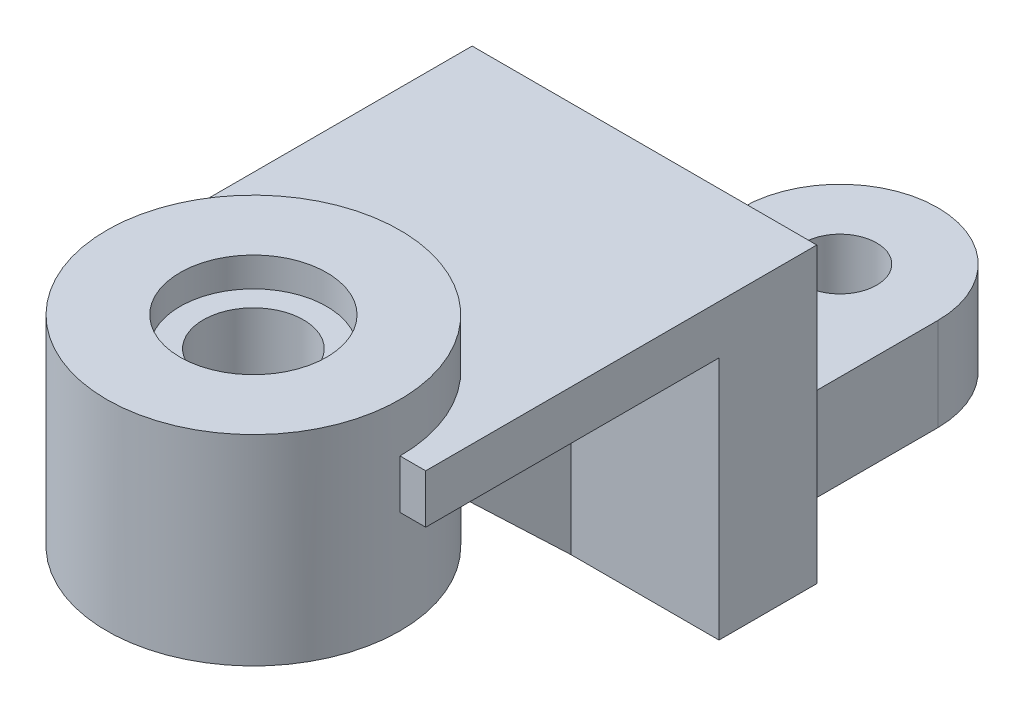
ISO-10303-21;
HEADER;
FILE_DESCRIPTION(('STEP AP214'),'2;1');
FILE_NAME('part.step','',(''),(''),'','','');
FILE_SCHEMA(('AUTOMOTIVE_DESIGN { 1 0 10303 214 1 1 1 1 }'));
ENDSEC;
DATA;
#1=APPLICATION_CONTEXT('core data for automotive mechanical design processes');
#2=APPLICATION_PROTOCOL_DEFINITION('international standard','automotive_design',2000,#1);
#3=PRODUCT_CONTEXT('',#1,'mechanical');
#4=PRODUCT('Part','Part','',(#3));
#5=PRODUCT_RELATED_PRODUCT_CATEGORY('part','',(#4));
#6=PRODUCT_DEFINITION_FORMATION('','',#4);
#7=PRODUCT_DEFINITION_CONTEXT('part definition',#1,'design');
#8=PRODUCT_DEFINITION('design','',#6,#7);
#9=PRODUCT_DEFINITION_SHAPE('','',#8);
#10=(LENGTH_UNIT() NAMED_UNIT(*) SI_UNIT(.MILLI.,.METRE.));
#11=(NAMED_UNIT(*) PLANE_ANGLE_UNIT() SI_UNIT($,.RADIAN.));
#12=(NAMED_UNIT(*) SI_UNIT($,.STERADIAN.) SOLID_ANGLE_UNIT());
#13=UNCERTAINTY_MEASURE_WITH_UNIT(LENGTH_MEASURE(1.E-05),#10,'distance_accuracy_value','');
#14=(GEOMETRIC_REPRESENTATION_CONTEXT(3) GLOBAL_UNCERTAINTY_ASSIGNED_CONTEXT((#13)) GLOBAL_UNIT_ASSIGNED_CONTEXT((#10,
#11,#12)) REPRESENTATION_CONTEXT('',''));
#15=CARTESIAN_POINT('',(0.,0.,0.));
#16=DIRECTION('',(0.,0.,1.));
#17=DIRECTION('',(1.,0.,0.));
#18=AXIS2_PLACEMENT_3D('',#15,#16,#17);
#19=CARTESIAN_POINT('',(35.25,60.,60.));
#20=DIRECTION('',(0.,0.,-1.));
#21=DIRECTION('',(-1.,0.,0.));
#22=AXIS2_PLACEMENT_3D('',#19,#20,#21);
#23=PLANE('',#22);
#24=DIRECTION('',(0.,-1.,0.));
#25=VECTOR('',#24,1.);
#26=CARTESIAN_POINT('',(5.,59.,60.));
#27=LINE('',#26,#25);
#28=CARTESIAN_POINT('',(5.,50.,60.));
#29=VERTEX_POINT('',#28);
#30=CARTESIAN_POINT('',(5.,0.,60.));
#31=VERTEX_POINT('',#30);
#32=EDGE_CURVE('E177',#29,#31,#27,.T.);
#33=ORIENTED_EDGE('',*,*,#32,.T.);
#34=DIRECTION('',(1.,0.,0.));
#35=VECTOR('',#34,1.);
#36=CARTESIAN_POINT('',(35.25,0.,60.));
#37=LINE('',#36,#35);
#38=CARTESIAN_POINT('',(35.25,0.,60.));
#39=VERTEX_POINT('',#38);
#40=EDGE_CURVE('E197',#31,#39,#37,.T.);
#41=ORIENTED_EDGE('',*,*,#40,.T.);
#42=DIRECTION('',(0.,-1.,0.));
#43=VECTOR('',#42,1.);
#44=CARTESIAN_POINT('',(35.25,60.,60.));
#45=LINE('',#44,#43);
#46=CARTESIAN_POINT('',(35.25,50.,60.));
#47=VERTEX_POINT('',#46);
#48=EDGE_CURVE('E217',#47,#39,#45,.T.);
#49=ORIENTED_EDGE('',*,*,#48,.F.);
#50=DIRECTION('',(1.,0.,0.));
#51=VECTOR('',#50,1.);
#52=CARTESIAN_POINT('',(-35.25,50.,60.));
#53=LINE('',#52,#51);
#54=EDGE_CURVE('E311',#29,#47,#53,.T.);
#55=ORIENTED_EDGE('',*,*,#54,.F.);
#56=EDGE_LOOP('',(#33,#41,#49,#55));
#57=FACE_BOUND('',#56,.T.);
#58=ADVANCED_FACE('F41',(#57),#23,.F.);
#59=CARTESIAN_POINT('',(-35.25,0.,60.));
#60=VERTEX_POINT('',#59);
#61=CARTESIAN_POINT('',(-5.,0.,60.));
#62=VERTEX_POINT('',#61);
#63=EDGE_CURVE('E195',#60,#62,#37,.T.);
#64=ORIENTED_EDGE('',*,*,#63,.T.);
#65=DIRECTION('',(0.,-1.,0.));
#66=VECTOR('',#65,1.);
#67=CARTESIAN_POINT('',(-5.,59.,60.));
#68=LINE('',#67,#66);
#69=CARTESIAN_POINT('',(-5.,50.,60.));
#70=VERTEX_POINT('',#69);
#71=EDGE_CURVE('E169',#70,#62,#68,.T.);
#72=ORIENTED_EDGE('',*,*,#71,.F.);
#73=CARTESIAN_POINT('',(-35.25,50.,60.));
#74=VERTEX_POINT('',#73);
#75=EDGE_CURVE('E309',#74,#70,#53,.T.);
#76=ORIENTED_EDGE('',*,*,#75,.F.);
#77=DIRECTION('',(0.,-1.,0.));
#78=VECTOR('',#77,1.);
#79=CARTESIAN_POINT('',(-35.25,60.,60.));
#80=LINE('',#79,#78);
#81=EDGE_CURVE('E203',#74,#60,#80,.T.);
#82=ORIENTED_EDGE('',*,*,#81,.T.);
#83=EDGE_LOOP('',(#64,#72,#76,#82));
#84=FACE_BOUND('',#83,.T.);
#85=ADVANCED_FACE('F200',(#84),#23,.F.);
#86=CARTESIAN_POINT('',(-35.25,50.,120.));
#87=DIRECTION('',(0.,-1.,0.));
#88=DIRECTION('',(0.,0.,-1.));
#89=AXIS2_PLACEMENT_3D('',#86,#87,#88);
#90=PLANE('',#89);
#91=DIRECTION('',(0.,0.,-1.));
#92=VECTOR('',#91,1.);
#93=CARTESIAN_POINT('',(-5.,50.,120.));
#94=LINE('',#93,#92);
#95=CARTESIAN_POINT('',(-5.,50.,90.4196010845019));
#96=VERTEX_POINT('',#95);
#97=EDGE_CURVE('E171',#96,#70,#94,.T.);
#98=ORIENTED_EDGE('',*,*,#97,.F.);
#99=CARTESIAN_POINT('',(0.,50.,120.));
#100=DIRECTION('',(0.,-1.,0.));
#101=DIRECTION('',(0.,0.,-1.));
#102=AXIS2_PLACEMENT_3D('',#99,#100,#101);
#103=CIRCLE('',#102,30.);
#104=CARTESIAN_POINT('',(-30.,50.,120.));
#105=VERTEX_POINT('',#104);
#106=EDGE_CURVE('E11',#105,#96,#103,.T.);
#107=ORIENTED_EDGE('',*,*,#106,.F.);
#108=DIRECTION('',(1.,0.,0.));
#109=VECTOR('',#108,1.);
#110=CARTESIAN_POINT('',(-35.25,50.,120.));
#111=LINE('',#110,#109);
#112=CARTESIAN_POINT('',(-35.25,50.,120.));
#113=VERTEX_POINT('',#112);
#114=EDGE_CURVE('E314',#113,#105,#111,.T.);
#115=ORIENTED_EDGE('',*,*,#114,.F.);
#116=DIRECTION('',(0.,0.,-1.));
#117=VECTOR('',#116,1.);
#118=CARTESIAN_POINT('',(-35.25,50.,120.));
#119=LINE('',#118,#117);
#120=EDGE_CURVE('E301',#113,#74,#119,.T.);
#121=ORIENTED_EDGE('',*,*,#120,.T.);
#122=ORIENTED_EDGE('',*,*,#75,.T.);
#123=EDGE_LOOP('',(#98,#107,#115,#121,#122));
#124=FACE_BOUND('',#123,.T.);
#125=ADVANCED_FACE('F426',(#124),#90,.T.);
#126=CARTESIAN_POINT('',(0.,29.,120.));
#127=DIRECTION('',(0.,1.,0.));
#128=DIRECTION('',(0.,0.,1.));
#129=AXIS2_PLACEMENT_3D('',#126,#127,#128);
#130=CYLINDRICAL_SURFACE('',#129,10.25);
#131=CARTESIAN_POINT('',(0.,64.,120.));
#132=DIRECTION('',(0.,1.,0.));
#133=DIRECTION('',(0.,0.,1.));
#134=AXIS2_PLACEMENT_3D('',#131,#132,#133);
#135=CIRCLE('',#134,10.25);
#136=CARTESIAN_POINT('',(0.,64.,130.25));
#137=VERTEX_POINT('',#136);
#138=EDGE_CURVE('E270',#137,#137,#135,.F.);
#139=ORIENTED_EDGE('',*,*,#138,.F.);
#140=EDGE_LOOP('',(#139));
#141=FACE_BOUND('',#140,.T.);
#142=CARTESIAN_POINT('',(0.,35.,120.));
#143=DIRECTION('',(0.,-1.,0.));
#144=DIRECTION('',(0.,0.,-1.));
#145=AXIS2_PLACEMENT_3D('',#142,#143,#144);
#146=CIRCLE('',#145,10.25);
#147=CARTESIAN_POINT('',(0.,35.,109.75));
#148=VERTEX_POINT('',#147);
#149=EDGE_CURVE('E44',#148,#148,#146,.F.);
#150=ORIENTED_EDGE('',*,*,#149,.F.);
#151=EDGE_LOOP('',(#150));
#152=FACE_BOUND('',#151,.T.);
#153=ADVANCED_FACE('F505',(#141,#152),#130,.F.);
#154=CARTESIAN_POINT('',(-35.25,60.,120.));
#155=DIRECTION('',(0.,0.,1.));
#156=DIRECTION('',(1.,0.,0.));
#157=AXIS2_PLACEMENT_3D('',#154,#155,#156);
#158=PLANE('',#157);
#159=ORIENTED_EDGE('',*,*,#114,.T.);
#160=DIRECTION('',(0.,1.,0.));
#161=VECTOR('',#160,1.);
#162=CARTESIAN_POINT('',(-30.,-10.5,120.));
#163=LINE('',#162,#161);
#164=CARTESIAN_POINT('',(-30.,60.,120.));
#165=VERTEX_POINT('',#164);
#166=EDGE_CURVE('E295',#105,#165,#163,.T.);
#167=ORIENTED_EDGE('',*,*,#166,.T.);
#168=DIRECTION('',(1.,0.,0.));
#169=VECTOR('',#168,1.);
#170=CARTESIAN_POINT('',(-35.25,60.,120.));
#171=LINE('',#170,#169);
#172=CARTESIAN_POINT('',(-35.25,60.,120.));
#173=VERTEX_POINT('',#172);
#174=EDGE_CURVE('E320',#173,#165,#171,.T.);
#175=ORIENTED_EDGE('',*,*,#174,.F.);
#176=DIRECTION('',(0.,-1.,0.));
#177=VECTOR('',#176,1.);
#178=CARTESIAN_POINT('',(-35.25,60.,120.));
#179=LINE('',#178,#177);
#180=EDGE_CURVE('E296',#173,#113,#179,.T.);
#181=ORIENTED_EDGE('',*,*,#180,.T.);
#182=EDGE_LOOP('',(#159,#167,#175,#181));
#183=FACE_BOUND('',#182,.T.);
#184=ADVANCED_FACE('F375',(#183),#158,.T.);
#185=CARTESIAN_POINT('',(0.,60.,0.));
#186=DIRECTION('',(0.,-1.,0.));
#187=DIRECTION('',(0.,0.,-1.));
#188=AXIS2_PLACEMENT_3D('',#185,#186,#187);
#189=PLANE('',#188);
#190=CARTESIAN_POINT('',(0.,60.,120.));
#191=DIRECTION('',(0.,1.,0.));
#192=DIRECTION('',(0.,0.,1.));
#193=AXIS2_PLACEMENT_3D('',#190,#191,#192);
#194=CIRCLE('',#193,30.);
#195=CARTESIAN_POINT('',(30.,60.,120.));
#196=VERTEX_POINT('',#195);
#197=EDGE_CURVE('E288',#196,#165,#194,.T.);
#198=ORIENTED_EDGE('',*,*,#197,.F.);
#199=CARTESIAN_POINT('',(35.25,60.,120.));
#200=VERTEX_POINT('',#199);
#201=EDGE_CURVE('E305',#196,#200,#171,.T.);
#202=ORIENTED_EDGE('',*,*,#201,.T.);
#203=DIRECTION('',(0.,0.,-1.));
#204=VECTOR('',#203,1.);
#205=CARTESIAN_POINT('',(35.25,60.,40.));
#206=LINE('',#205,#204);
#207=CARTESIAN_POINT('',(35.25,60.,40.));
#208=VERTEX_POINT('',#207);
#209=EDGE_CURVE('E218',#200,#208,#206,.T.);
#210=ORIENTED_EDGE('',*,*,#209,.T.);
#211=DIRECTION('',(-1.,0.,0.));
#212=VECTOR('',#211,1.);
#213=CARTESIAN_POINT('',(-35.25,60.,40.));
#214=LINE('',#213,#212);
#215=CARTESIAN_POINT('',(-35.25,60.,40.));
#216=VERTEX_POINT('',#215);
#217=EDGE_CURVE('E212',#208,#216,#214,.T.);
#218=ORIENTED_EDGE('',*,*,#217,.T.);
#219=DIRECTION('',(0.,0.,1.));
#220=VECTOR('',#219,1.);
#221=CARTESIAN_POINT('',(-35.25,60.,60.));
#222=LINE('',#221,#220);
#223=EDGE_CURVE('E330',#216,#173,#222,.T.);
#224=ORIENTED_EDGE('',*,*,#223,.T.);
#225=ORIENTED_EDGE('',*,*,#174,.T.);
#226=EDGE_LOOP('',(#198,#202,#210,#218,#224,#225));
#227=FACE_BOUND('',#226,.T.);
#228=ADVANCED_FACE('F334',(#227),#189,.F.);
#229=CARTESIAN_POINT('',(20.,19.,40.));
#230=DIRECTION('',(-1.,0.,0.));
#231=DIRECTION('',(0.,0.,1.));
#232=AXIS2_PLACEMENT_3D('',#229,#230,#231);
#233=PLANE('',#232);
#234=DIRECTION('',(0.,0.,-1.));
#235=VECTOR('',#234,1.);
#236=CARTESIAN_POINT('',(20.,19.,40.));
#237=LINE('',#236,#235);
#238=CARTESIAN_POINT('',(20.,19.,30.));
#239=VERTEX_POINT('',#238);
#240=CARTESIAN_POINT('',(20.,19.,0.));
#241=VERTEX_POINT('',#240);
#242=EDGE_CURVE('E230',#239,#241,#237,.T.);
#243=ORIENTED_EDGE('',*,*,#242,.F.);
#244=DIRECTION('',(0.,-1.,0.));
#245=VECTOR('',#244,1.);
#246=CARTESIAN_POINT('',(20.,0.,30.));
#247=LINE('',#246,#245);
#248=CARTESIAN_POINT('',(20.,0.,30.));
#249=VERTEX_POINT('',#248);
#250=EDGE_CURVE('E249',#239,#249,#247,.T.);
#251=ORIENTED_EDGE('',*,*,#250,.T.);
#252=DIRECTION('',(0.,0.,-1.));
#253=VECTOR('',#252,1.);
#254=CARTESIAN_POINT('',(20.,0.,40.));
#255=LINE('',#254,#253);
#256=CARTESIAN_POINT('',(20.,0.,0.));
#257=VERTEX_POINT('',#256);
#258=EDGE_CURVE('E228',#249,#257,#255,.T.);
#259=ORIENTED_EDGE('',*,*,#258,.T.);
#260=DIRECTION('',(0.,-1.,0.));
#261=VECTOR('',#260,1.);
#262=CARTESIAN_POINT('',(20.,19.,0.));
#263=LINE('',#262,#261);
#264=EDGE_CURVE('E244',#241,#257,#263,.T.);
#265=ORIENTED_EDGE('',*,*,#264,.F.);
#266=EDGE_LOOP('',(#243,#251,#259,#265));
#267=FACE_BOUND('',#266,.T.);
#268=ADVANCED_FACE('F349',(#267),#233,.F.);
#269=CARTESIAN_POINT('',(0.,19.,0.));
#270=DIRECTION('',(0.,-1.,0.));
#271=DIRECTION('',(0.,0.,-1.));
#272=AXIS2_PLACEMENT_3D('',#269,#270,#271);
#273=CYLINDRICAL_SURFACE('',#272,20.);
#274=CARTESIAN_POINT('',(0.,0.,0.));
#275=DIRECTION('',(0.,1.,0.));
#276=DIRECTION('',(0.,0.,1.));
#277=AXIS2_PLACEMENT_3D('',#274,#275,#276);
#278=CIRCLE('',#277,20.);
#279=CARTESIAN_POINT('',(-20.,0.,0.));
#280=VERTEX_POINT('',#279);
#281=EDGE_CURVE('E239',#257,#280,#278,.T.);
#282=ORIENTED_EDGE('',*,*,#281,.T.);
#283=DIRECTION('',(0.,-1.,0.));
#284=VECTOR('',#283,1.);
#285=CARTESIAN_POINT('',(-20.,19.,0.));
#286=LINE('',#285,#284);
#287=CARTESIAN_POINT('',(-20.,19.,0.));
#288=VERTEX_POINT('',#287);
#289=EDGE_CURVE('E240',#288,#280,#286,.T.);
#290=ORIENTED_EDGE('',*,*,#289,.F.);
#291=CARTESIAN_POINT('',(0.,19.,0.));
#292=DIRECTION('',(0.,1.,0.));
#293=DIRECTION('',(0.,0.,1.));
#294=AXIS2_PLACEMENT_3D('',#291,#292,#293);
#295=CIRCLE('',#294,20.);
#296=EDGE_CURVE('E227',#241,#288,#295,.T.);
#297=ORIENTED_EDGE('',*,*,#296,.F.);
#298=ORIENTED_EDGE('',*,*,#264,.T.);
#299=EDGE_LOOP('',(#282,#290,#297,#298));
#300=FACE_BOUND('',#299,.T.);
#301=ADVANCED_FACE('F356',(#300),#273,.T.);
#302=CARTESIAN_POINT('',(-20.,19.,0.));
#303=DIRECTION('',(1.,0.,0.));
#304=DIRECTION('',(0.,0.,-1.));
#305=AXIS2_PLACEMENT_3D('',#302,#303,#304);
#306=PLANE('',#305);
#307=DIRECTION('',(0.,0.,1.));
#308=VECTOR('',#307,1.);
#309=CARTESIAN_POINT('',(-20.,0.,0.));
#310=LINE('',#309,#308);
#311=CARTESIAN_POINT('',(-20.,0.,30.));
#312=VERTEX_POINT('',#311);
#313=EDGE_CURVE('E229',#280,#312,#310,.T.);
#314=ORIENTED_EDGE('',*,*,#313,.T.);
#315=DIRECTION('',(0.,-1.,0.));
#316=VECTOR('',#315,1.);
#317=CARTESIAN_POINT('',(-20.,19.,30.));
#318=LINE('',#317,#316);
#319=CARTESIAN_POINT('',(-20.,19.,30.));
#320=VERTEX_POINT('',#319);
#321=EDGE_CURVE('E261',#312,#320,#318,.F.);
#322=ORIENTED_EDGE('',*,*,#321,.T.);
#323=DIRECTION('',(0.,0.,1.));
#324=VECTOR('',#323,1.);
#325=CARTESIAN_POINT('',(-20.,19.,0.));
#326=LINE('',#325,#324);
#327=EDGE_CURVE('E232',#288,#320,#326,.T.);
#328=ORIENTED_EDGE('',*,*,#327,.F.);
#329=ORIENTED_EDGE('',*,*,#289,.T.);
#330=EDGE_LOOP('',(#314,#322,#328,#329));
#331=FACE_BOUND('',#330,.T.);
#332=ADVANCED_FACE('F360',(#331),#306,.F.);
#333=CARTESIAN_POINT('',(0.,19.,0.));
#334=DIRECTION('',(0.,1.,0.));
#335=DIRECTION('',(0.,0.,1.));
#336=AXIS2_PLACEMENT_3D('',#333,#334,#335);
#337=PLANE('',#336);
#338=CARTESIAN_POINT('',(0.,19.,0.));
#339=DIRECTION('',(0.,1.,0.));
#340=DIRECTION('',(0.,0.,1.));
#341=AXIS2_PLACEMENT_3D('',#338,#339,#340);
#342=CIRCLE('',#341,7.5);
#343=CARTESIAN_POINT('',(0.,19.,7.5));
#344=VERTEX_POINT('',#343);
#345=EDGE_CURVE('E325',#344,#344,#342,.T.);
#346=ORIENTED_EDGE('',*,*,#345,.F.);
#347=EDGE_LOOP('',(#346));
#348=FACE_BOUND('',#347,.T.);
#349=DIRECTION('',(1.,0.,0.));
#350=VECTOR('',#349,1.);
#351=CARTESIAN_POINT('',(-20.,19.,40.));
#352=LINE('',#351,#350);
#353=CARTESIAN_POINT('',(-30.,19.,40.));
#354=VERTEX_POINT('',#353);
#355=CARTESIAN_POINT('',(30.,19.,40.));
#356=VERTEX_POINT('',#355);
#357=EDGE_CURVE('E235',#354,#356,#352,.T.);
#358=ORIENTED_EDGE('',*,*,#357,.T.);
#359=CARTESIAN_POINT('',(30.,19.,30.));
#360=DIRECTION('',(0.,1.,0.));
#361=DIRECTION('',(0.,0.,1.));
#362=AXIS2_PLACEMENT_3D('',#359,#360,#361);
#363=CIRCLE('',#362,10.);
#364=EDGE_CURVE('E258',#356,#239,#363,.F.);
#365=ORIENTED_EDGE('',*,*,#364,.T.);
#366=ORIENTED_EDGE('',*,*,#242,.T.);
#367=ORIENTED_EDGE('',*,*,#296,.T.);
#368=ORIENTED_EDGE('',*,*,#327,.T.);
#369=CARTESIAN_POINT('',(-30.,19.,30.));
#370=DIRECTION('',(0.,1.,0.));
#371=DIRECTION('',(0.,0.,1.));
#372=AXIS2_PLACEMENT_3D('',#369,#370,#371);
#373=CIRCLE('',#372,10.);
#374=EDGE_CURVE('E264',#320,#354,#373,.F.);
#375=ORIENTED_EDGE('',*,*,#374,.T.);
#376=EDGE_LOOP('',(#358,#365,#366,#367,#368,#375));
#377=FACE_BOUND('',#376,.T.);
#378=ADVANCED_FACE('F351',(#348,#377),#337,.T.);
#379=CARTESIAN_POINT('',(0.,0.,0.));
#380=DIRECTION('',(0.,1.,0.));
#381=DIRECTION('',(0.,0.,1.));
#382=AXIS2_PLACEMENT_3D('',#379,#380,#381);
#383=PLANE('',#382);
#384=CARTESIAN_POINT('',(0.,0.,0.));
#385=DIRECTION('',(0.,-1.,0.));
#386=DIRECTION('',(0.,0.,-1.));
#387=AXIS2_PLACEMENT_3D('',#384,#385,#386);
#388=CIRCLE('',#387,7.5);
#389=CARTESIAN_POINT('',(0.,0.,-7.5));
#390=VERTEX_POINT('',#389);
#391=EDGE_CURVE('E315',#390,#390,#388,.T.);
#392=ORIENTED_EDGE('',*,*,#391,.F.);
#393=EDGE_LOOP('',(#392));
#394=FACE_BOUND('',#393,.T.);
#395=ORIENTED_EDGE('',*,*,#258,.F.);
#396=CARTESIAN_POINT('',(30.,0.,30.));
#397=DIRECTION('',(0.,1.,0.));
#398=DIRECTION('',(0.,0.,1.));
#399=AXIS2_PLACEMENT_3D('',#396,#397,#398);
#400=CIRCLE('',#399,10.);
#401=CARTESIAN_POINT('',(30.,0.,40.));
#402=VERTEX_POINT('',#401);
#403=EDGE_CURVE('E255',#249,#402,#400,.T.);
#404=ORIENTED_EDGE('',*,*,#403,.T.);
#405=DIRECTION('',(-1.,0.,0.));
#406=VECTOR('',#405,1.);
#407=CARTESIAN_POINT('',(0.,0.,40.));
#408=LINE('',#407,#406);
#409=CARTESIAN_POINT('',(35.25,0.,40.));
#410=VERTEX_POINT('',#409);
#411=EDGE_CURVE('E211',#410,#402,#408,.T.);
#412=ORIENTED_EDGE('',*,*,#411,.F.);
#413=DIRECTION('',(0.,0.,-1.));
#414=VECTOR('',#413,1.);
#415=CARTESIAN_POINT('',(35.25,0.,40.));
#416=LINE('',#415,#414);
#417=EDGE_CURVE('E201',#39,#410,#416,.T.);
#418=ORIENTED_EDGE('',*,*,#417,.F.);
#419=ORIENTED_EDGE('',*,*,#40,.F.);
#420=DIRECTION('',(1.,0.,0.));
#421=VECTOR('',#420,1.);
#422=CARTESIAN_POINT('',(-5.,0.,60.));
#423=LINE('',#422,#421);
#424=EDGE_CURVE('E184',#62,#31,#423,.T.);
#425=ORIENTED_EDGE('',*,*,#424,.F.);
#426=ORIENTED_EDGE('',*,*,#63,.F.);
#427=DIRECTION('',(0.,0.,1.));
#428=VECTOR('',#427,1.);
#429=CARTESIAN_POINT('',(-35.25,0.,60.));
#430=LINE('',#429,#428);
#431=CARTESIAN_POINT('',(-35.25,0.,40.));
#432=VERTEX_POINT('',#431);
#433=EDGE_CURVE('E210',#432,#60,#430,.T.);
#434=ORIENTED_EDGE('',*,*,#433,.F.);
#435=CARTESIAN_POINT('',(-30.,0.,40.));
#436=VERTEX_POINT('',#435);
#437=EDGE_CURVE('E202',#436,#432,#408,.T.);
#438=ORIENTED_EDGE('',*,*,#437,.F.);
#439=CARTESIAN_POINT('',(-30.,0.,30.));
#440=DIRECTION('',(0.,1.,0.));
#441=DIRECTION('',(0.,0.,1.));
#442=AXIS2_PLACEMENT_3D('',#439,#440,#441);
#443=CIRCLE('',#442,10.);
#444=EDGE_CURVE('E263',#436,#312,#443,.T.);
#445=ORIENTED_EDGE('',*,*,#444,.T.);
#446=ORIENTED_EDGE('',*,*,#313,.F.);
#447=ORIENTED_EDGE('',*,*,#281,.F.);
#448=EDGE_LOOP('',(#395,#404,#412,#418,#419,#425,#426,#434,#438,#445,#446,#447));
#449=FACE_BOUND('',#448,.T.);
#450=ADVANCED_FACE('F194',(#394,#449),#383,.F.);
#451=CARTESIAN_POINT('',(-35.25,60.,60.));
#452=DIRECTION('',(1.,0.,0.));
#453=DIRECTION('',(0.,0.,-1.));
#454=AXIS2_PLACEMENT_3D('',#451,#452,#453);
#455=PLANE('',#454);
#456=ORIENTED_EDGE('',*,*,#433,.T.);
#457=ORIENTED_EDGE('',*,*,#81,.F.);
#458=ORIENTED_EDGE('',*,*,#120,.F.);
#459=ORIENTED_EDGE('',*,*,#180,.F.);
#460=ORIENTED_EDGE('',*,*,#223,.F.);
#461=DIRECTION('',(0.,-1.,0.));
#462=VECTOR('',#461,1.);
#463=CARTESIAN_POINT('',(-35.25,60.,40.));
#464=LINE('',#463,#462);
#465=EDGE_CURVE('E224',#216,#432,#464,.T.);
#466=ORIENTED_EDGE('',*,*,#465,.T.);
#467=EDGE_LOOP('',(#456,#457,#458,#459,#460,#466));
#468=FACE_BOUND('',#467,.T.);
#469=ADVANCED_FACE('F370',(#468),#455,.F.);
#470=CARTESIAN_POINT('',(35.25,60.,40.));
#471=DIRECTION('',(-1.,0.,0.));
#472=DIRECTION('',(0.,0.,1.));
#473=AXIS2_PLACEMENT_3D('',#470,#471,#472);
#474=PLANE('',#473);
#475=ORIENTED_EDGE('',*,*,#417,.T.);
#476=DIRECTION('',(0.,-1.,0.));
#477=VECTOR('',#476,1.);
#478=CARTESIAN_POINT('',(35.25,60.,40.));
#479=LINE('',#478,#477);
#480=EDGE_CURVE('E214',#208,#410,#479,.T.);
#481=ORIENTED_EDGE('',*,*,#480,.F.);
#482=ORIENTED_EDGE('',*,*,#209,.F.);
#483=DIRECTION('',(0.,-1.,0.));
#484=VECTOR('',#483,1.);
#485=CARTESIAN_POINT('',(35.25,60.,120.));
#486=LINE('',#485,#484);
#487=CARTESIAN_POINT('',(35.25,50.,120.));
#488=VERTEX_POINT('',#487);
#489=EDGE_CURVE('E298',#200,#488,#486,.T.);
#490=ORIENTED_EDGE('',*,*,#489,.T.);
#491=DIRECTION('',(0.,0.,-1.));
#492=VECTOR('',#491,1.);
#493=CARTESIAN_POINT('',(35.25,50.,120.));
#494=LINE('',#493,#492);
#495=EDGE_CURVE('E302',#488,#47,#494,.T.);
#496=ORIENTED_EDGE('',*,*,#495,.T.);
#497=ORIENTED_EDGE('',*,*,#48,.T.);
#498=EDGE_LOOP('',(#475,#481,#482,#490,#496,#497));
#499=FACE_BOUND('',#498,.T.);
#500=ADVANCED_FACE('F340',(#499),#474,.F.);
#501=CARTESIAN_POINT('',(0.,60.,40.));
#502=DIRECTION('',(0.,0.,1.));
#503=DIRECTION('',(1.,0.,0.));
#504=AXIS2_PLACEMENT_3D('',#501,#502,#503);
#505=PLANE('',#504);
#506=ORIENTED_EDGE('',*,*,#357,.F.);
#507=DIRECTION('',(0.,-1.,0.));
#508=VECTOR('',#507,1.);
#509=CARTESIAN_POINT('',(-30.,0.,40.));
#510=LINE('',#509,#508);
#511=EDGE_CURVE('E256',#354,#436,#510,.T.);
#512=ORIENTED_EDGE('',*,*,#511,.T.);
#513=ORIENTED_EDGE('',*,*,#437,.T.);
#514=ORIENTED_EDGE('',*,*,#465,.F.);
#515=ORIENTED_EDGE('',*,*,#217,.F.);
#516=ORIENTED_EDGE('',*,*,#480,.T.);
#517=ORIENTED_EDGE('',*,*,#411,.T.);
#518=DIRECTION('',(0.,-1.,0.));
#519=VECTOR('',#518,1.);
#520=CARTESIAN_POINT('',(30.,19.,40.));
#521=LINE('',#520,#519);
#522=EDGE_CURVE('E253',#402,#356,#521,.F.);
#523=ORIENTED_EDGE('',*,*,#522,.T.);
#524=EDGE_LOOP('',(#506,#512,#513,#514,#515,#516,#517,#523));
#525=FACE_BOUND('',#524,.T.);
#526=ADVANCED_FACE('F339',(#525),#505,.F.);
#527=CARTESIAN_POINT('',(30.,19.,30.));
#528=DIRECTION('',(0.,1.,0.));
#529=DIRECTION('',(0.,0.,1.));
#530=AXIS2_PLACEMENT_3D('',#527,#528,#529);
#531=CYLINDRICAL_SURFACE('',#530,10.);
#532=ORIENTED_EDGE('',*,*,#364,.F.);
#533=ORIENTED_EDGE('',*,*,#522,.F.);
#534=ORIENTED_EDGE('',*,*,#403,.F.);
#535=ORIENTED_EDGE('',*,*,#250,.F.);
#536=EDGE_LOOP('',(#532,#533,#534,#535));
#537=FACE_BOUND('',#536,.T.);
#538=ADVANCED_FACE('F347',(#537),#531,.F.);
#539=CARTESIAN_POINT('',(-30.,60.,30.));
#540=DIRECTION('',(0.,1.,0.));
#541=DIRECTION('',(0.,0.,1.));
#542=AXIS2_PLACEMENT_3D('',#539,#540,#541);
#543=CYLINDRICAL_SURFACE('',#542,10.);
#544=ORIENTED_EDGE('',*,*,#374,.F.);
#545=ORIENTED_EDGE('',*,*,#321,.F.);
#546=ORIENTED_EDGE('',*,*,#444,.F.);
#547=ORIENTED_EDGE('',*,*,#511,.F.);
#548=EDGE_LOOP('',(#544,#545,#546,#547));
#549=FACE_BOUND('',#548,.T.);
#550=ADVANCED_FACE('F43',(#549),#543,.F.);
#551=CARTESIAN_POINT('',(0.,60.,0.));
#552=DIRECTION('',(0.,-1.,0.));
#553=DIRECTION('',(0.,0.,-1.));
#554=AXIS2_PLACEMENT_3D('',#551,#552,#553);
#555=CYLINDRICAL_SURFACE('',#554,7.5);
#556=ORIENTED_EDGE('',*,*,#345,.T.);
#557=EDGE_LOOP('',(#556));
#558=FACE_BOUND('',#557,.T.);
#559=ORIENTED_EDGE('',*,*,#391,.T.);
#560=EDGE_LOOP('',(#559));
#561=FACE_BOUND('',#560,.T.);
#562=ADVANCED_FACE('F450',(#558,#561),#555,.F.);
#563=DIRECTION('',(0.,0.,1.));
#564=VECTOR('',#563,1.);
#565=CARTESIAN_POINT('',(5.,50.,120.));
#566=LINE('',#565,#564);
#567=CARTESIAN_POINT('',(5.,50.,90.4196010845019));
#568=VERTEX_POINT('',#567);
#569=EDGE_CURVE('E59',#29,#568,#566,.T.);
#570=ORIENTED_EDGE('',*,*,#569,.F.);
#571=ORIENTED_EDGE('',*,*,#54,.T.);
#572=ORIENTED_EDGE('',*,*,#495,.F.);
#573=CARTESIAN_POINT('',(30.,50.,120.));
#574=VERTEX_POINT('',#573);
#575=EDGE_CURVE('E316',#574,#488,#111,.T.);
#576=ORIENTED_EDGE('',*,*,#575,.F.);
#577=EDGE_CURVE('E49',#568,#574,#103,.T.);
#578=ORIENTED_EDGE('',*,*,#577,.F.);
#579=EDGE_LOOP('',(#570,#571,#572,#576,#578));
#580=FACE_BOUND('',#579,.T.);
#581=ADVANCED_FACE('F382',(#580),#90,.T.);
#582=DIRECTION('',(0.,1.,0.));
#583=VECTOR('',#582,1.);
#584=CARTESIAN_POINT('',(30.,-10.5,120.));
#585=LINE('',#584,#583);
#586=EDGE_CURVE('E291',#574,#196,#585,.T.);
#587=ORIENTED_EDGE('',*,*,#586,.F.);
#588=ORIENTED_EDGE('',*,*,#575,.T.);
#589=ORIENTED_EDGE('',*,*,#489,.F.);
#590=ORIENTED_EDGE('',*,*,#201,.F.);
#591=EDGE_LOOP('',(#587,#588,#589,#590));
#592=FACE_BOUND('',#591,.T.);
#593=ADVANCED_FACE('F379',(#592),#158,.T.);
#594=CARTESIAN_POINT('',(0.,70.,120.));
#595=DIRECTION('',(0.,-1.,0.));
#596=DIRECTION('',(0.,0.,-1.));
#597=AXIS2_PLACEMENT_3D('',#594,#595,#596);
#598=CYLINDRICAL_SURFACE('',#597,30.);
#599=CARTESIAN_POINT('',(0.,70.,120.));
#600=DIRECTION('',(0.,1.,0.));
#601=DIRECTION('',(0.,0.,1.));
#602=AXIS2_PLACEMENT_3D('',#599,#600,#601);
#603=CIRCLE('',#602,30.);
#604=CARTESIAN_POINT('',(0.,70.,150.));
#605=VERTEX_POINT('',#604);
#606=EDGE_CURVE('E273',#605,#605,#603,.T.);
#607=ORIENTED_EDGE('',*,*,#606,.F.);
#608=EDGE_LOOP('',(#607));
#609=FACE_BOUND('',#608,.T.);
#610=ORIENTED_EDGE('',*,*,#106,.T.);
#611=DIRECTION('',(0.,-1.,0.));
#612=VECTOR('',#611,1.);
#613=CARTESIAN_POINT('',(-5.,59.,90.4196010845019));
#614=LINE('',#613,#612);
#615=CARTESIAN_POINT('',(-5.,29.,90.4196010845019));
#616=VERTEX_POINT('',#615);
#617=EDGE_CURVE('E386',#96,#616,#614,.T.);
#618=ORIENTED_EDGE('',*,*,#617,.T.);
#619=CARTESIAN_POINT('',(0.,29.,120.));
#620=DIRECTION('',(0.,1.,0.));
#621=DIRECTION('',(0.,0.,1.));
#622=AXIS2_PLACEMENT_3D('',#619,#620,#621);
#623=CIRCLE('',#622,30.);
#624=CARTESIAN_POINT('',(5.,29.,90.4196010845019));
#625=VERTEX_POINT('',#624);
#626=EDGE_CURVE('E267',#616,#625,#623,.T.);
#627=ORIENTED_EDGE('',*,*,#626,.T.);
#628=DIRECTION('',(0.,-1.,0.));
#629=VECTOR('',#628,1.);
#630=CARTESIAN_POINT('',(5.,59.,90.4196010845019));
#631=LINE('',#630,#629);
#632=EDGE_CURVE('E390',#568,#625,#631,.T.);
#633=ORIENTED_EDGE('',*,*,#632,.F.);
#634=ORIENTED_EDGE('',*,*,#577,.T.);
#635=ORIENTED_EDGE('',*,*,#586,.T.);
#636=ORIENTED_EDGE('',*,*,#197,.T.);
#637=ORIENTED_EDGE('',*,*,#166,.F.);
#638=EDGE_LOOP('',(#610,#618,#627,#633,#634,#635,#636,#637));
#639=FACE_BOUND('',#638,.T.);
#640=ADVANCED_FACE('F374',(#609,#639),#598,.T.);
#641=CARTESIAN_POINT('',(0.,70.,120.));
#642=DIRECTION('',(0.,1.,0.));
#643=DIRECTION('',(0.,0.,1.));
#644=AXIS2_PLACEMENT_3D('',#641,#642,#643);
#645=PLANE('',#644);
#646=CARTESIAN_POINT('',(0.,70.,120.));
#647=DIRECTION('',(0.,1.,0.));
#648=DIRECTION('',(0.,0.,1.));
#649=AXIS2_PLACEMENT_3D('',#646,#647,#648);
#650=CIRCLE('',#649,15.);
#651=CARTESIAN_POINT('',(0.,70.,135.));
#652=VERTEX_POINT('',#651);
#653=EDGE_CURVE('E280',#652,#652,#650,.T.);
#654=ORIENTED_EDGE('',*,*,#653,.F.);
#655=EDGE_LOOP('',(#654));
#656=FACE_BOUND('',#655,.T.);
#657=ORIENTED_EDGE('',*,*,#606,.T.);
#658=EDGE_LOOP('',(#657));
#659=FACE_BOUND('',#658,.T.);
#660=ADVANCED_FACE('F410',(#656,#659),#645,.T.);
#661=CARTESIAN_POINT('',(0.,29.,120.));
#662=DIRECTION('',(0.,1.,0.));
#663=DIRECTION('',(0.,0.,1.));
#664=AXIS2_PLACEMENT_3D('',#661,#662,#663);
#665=PLANE('',#664);
#666=ORIENTED_EDGE('',*,*,#626,.F.);
#667=DIRECTION('',(1.,0.,0.));
#668=VECTOR('',#667,1.);
#669=CARTESIAN_POINT('',(-5.,29.,90.4196010845019));
#670=LINE('',#669,#668);
#671=EDGE_CURVE('E179',#616,#625,#670,.T.);
#672=ORIENTED_EDGE('',*,*,#671,.T.);
#673=EDGE_LOOP('',(#666,#672));
#674=FACE_BOUND('',#673,.T.);
#675=CARTESIAN_POINT('',(0.,29.,120.));
#676=DIRECTION('',(0.,-1.,0.));
#677=DIRECTION('',(0.,0.,-1.));
#678=AXIS2_PLACEMENT_3D('',#675,#676,#677);
#679=CIRCLE('',#678,15.);
#680=CARTESIAN_POINT('',(0.,29.,105.));
#681=VERTEX_POINT('',#680);
#682=EDGE_CURVE('E282',#681,#681,#679,.T.);
#683=ORIENTED_EDGE('',*,*,#682,.F.);
#684=EDGE_LOOP('',(#683));
#685=FACE_BOUND('',#684,.T.);
#686=ADVANCED_FACE('F404',(#674,#685),#665,.F.);
#687=CARTESIAN_POINT('',(0.,64.,120.));
#688=DIRECTION('',(0.,1.,0.));
#689=DIRECTION('',(0.,0.,1.));
#690=AXIS2_PLACEMENT_3D('',#687,#688,#689);
#691=PLANE('',#690);
#692=CARTESIAN_POINT('',(0.,64.,120.));
#693=DIRECTION('',(0.,1.,0.));
#694=DIRECTION('',(0.,0.,1.));
#695=AXIS2_PLACEMENT_3D('',#692,#693,#694);
#696=CIRCLE('',#695,15.);
#697=CARTESIAN_POINT('',(0.,64.,135.));
#698=VERTEX_POINT('',#697);
#699=EDGE_CURVE('E269',#698,#698,#696,.T.);
#700=ORIENTED_EDGE('',*,*,#699,.T.);
#701=EDGE_LOOP('',(#700));
#702=FACE_BOUND('',#701,.T.);
#703=ORIENTED_EDGE('',*,*,#138,.T.);
#704=EDGE_LOOP('',(#703));
#705=FACE_BOUND('',#704,.T.);
#706=ADVANCED_FACE('F408',(#702,#705),#691,.T.);
#707=CARTESIAN_POINT('',(0.,64.,120.));
#708=DIRECTION('',(0.,1.,0.));
#709=DIRECTION('',(0.,0.,1.));
#710=AXIS2_PLACEMENT_3D('',#707,#708,#709);
#711=CYLINDRICAL_SURFACE('',#710,15.);
#712=ORIENTED_EDGE('',*,*,#699,.F.);
#713=EDGE_LOOP('',(#712));
#714=FACE_BOUND('',#713,.T.);
#715=ORIENTED_EDGE('',*,*,#653,.T.);
#716=EDGE_LOOP('',(#715));
#717=FACE_BOUND('',#716,.T.);
#718=ADVANCED_FACE('F415',(#714,#717),#711,.F.);
#719=CARTESIAN_POINT('',(0.,35.,120.));
#720=DIRECTION('',(0.,-1.,0.));
#721=DIRECTION('',(0.,0.,-1.));
#722=AXIS2_PLACEMENT_3D('',#719,#720,#721);
#723=PLANE('',#722);
#724=CARTESIAN_POINT('',(0.,35.,120.));
#725=DIRECTION('',(0.,-1.,0.));
#726=DIRECTION('',(0.,0.,-1.));
#727=AXIS2_PLACEMENT_3D('',#724,#725,#726);
#728=CIRCLE('',#727,15.);
#729=CARTESIAN_POINT('',(0.,35.,105.));
#730=VERTEX_POINT('',#729);
#731=EDGE_CURVE('E392',#730,#730,#728,.T.);
#732=ORIENTED_EDGE('',*,*,#731,.T.);
#733=EDGE_LOOP('',(#732));
#734=FACE_BOUND('',#733,.T.);
#735=ORIENTED_EDGE('',*,*,#149,.T.);
#736=EDGE_LOOP('',(#735));
#737=FACE_BOUND('',#736,.T.);
#738=ADVANCED_FACE('F509',(#734,#737),#723,.T.);
#739=CARTESIAN_POINT('',(0.,35.,120.));
#740=DIRECTION('',(0.,-1.,0.));
#741=DIRECTION('',(0.,0.,-1.));
#742=AXIS2_PLACEMENT_3D('',#739,#740,#741);
#743=CYLINDRICAL_SURFACE('',#742,15.);
#744=ORIENTED_EDGE('',*,*,#731,.F.);
#745=EDGE_LOOP('',(#744));
#746=FACE_BOUND('',#745,.T.);
#747=ORIENTED_EDGE('',*,*,#682,.T.);
#748=EDGE_LOOP('',(#747));
#749=FACE_BOUND('',#748,.T.);
#750=ADVANCED_FACE('F405',(#746,#749),#743,.F.);
#751=CARTESIAN_POINT('',(-5.,59.,60.));
#752=DIRECTION('',(-1.,0.,0.));
#753=DIRECTION('',(0.,0.,1.));
#754=AXIS2_PLACEMENT_3D('',#751,#752,#753);
#755=PLANE('',#754);
#756=ORIENTED_EDGE('',*,*,#617,.F.);
#757=ORIENTED_EDGE('',*,*,#97,.T.);
#758=ORIENTED_EDGE('',*,*,#71,.T.);
#759=DIRECTION('',(0.,-0.690016307403161,-0.723793821138111));
#760=VECTOR('',#759,1.);
#761=CARTESIAN_POINT('',(-5.,0.,60.));
#762=LINE('',#761,#760);
#763=EDGE_CURVE('E173',#616,#62,#762,.T.);
#764=ORIENTED_EDGE('',*,*,#763,.F.);
#765=EDGE_LOOP('',(#756,#757,#758,#764));
#766=FACE_BOUND('',#765,.T.);
#767=ADVANCED_FACE('F168',(#766),#755,.T.);
#768=CARTESIAN_POINT('',(5.,59.,60.));
#769=DIRECTION('',(1.,0.,0.));
#770=DIRECTION('',(0.,0.,-1.));
#771=AXIS2_PLACEMENT_3D('',#768,#769,#770);
#772=PLANE('',#771);
#773=ORIENTED_EDGE('',*,*,#32,.F.);
#774=ORIENTED_EDGE('',*,*,#569,.T.);
#775=ORIENTED_EDGE('',*,*,#632,.T.);
#776=DIRECTION('',(0.,-0.690016307403161,-0.723793821138111));
#777=VECTOR('',#776,1.);
#778=CARTESIAN_POINT('',(5.,0.,60.));
#779=LINE('',#778,#777);
#780=EDGE_CURVE('E190',#625,#31,#779,.T.);
#781=ORIENTED_EDGE('',*,*,#780,.T.);
#782=EDGE_LOOP('',(#773,#774,#775,#781));
#783=FACE_BOUND('',#782,.T.);
#784=ADVANCED_FACE('F651',(#783),#772,.T.);
#785=CARTESIAN_POINT('',(-5.,0.,60.));
#786=DIRECTION('',(0.,-0.723793821138111,0.690016307403161));
#787=DIRECTION('',(0.,-0.690016307403161,-0.723793821138111));
#788=AXIS2_PLACEMENT_3D('',#785,#786,#787);
#789=PLANE('',#788);
#790=ORIENTED_EDGE('',*,*,#780,.F.);
#791=ORIENTED_EDGE('',*,*,#671,.F.);
#792=ORIENTED_EDGE('',*,*,#763,.T.);
#793=ORIENTED_EDGE('',*,*,#424,.T.);
#794=EDGE_LOOP('',(#790,#791,#792,#793));
#795=FACE_BOUND('',#794,.T.);
#796=ADVANCED_FACE('F181',(#795),#789,.T.);
#797=CLOSED_SHELL('',(#58,#85,#125,#153,#184,#228,#268,#301,#332,#378,#450,#469,#500,#526,#538,
#550,#562,#581,#593,#640,#660,#686,#706,#718,#738,#750,#767,#784,#796));
#798=MANIFOLD_SOLID_BREP('B2',#797);
#799=ADVANCED_BREP_SHAPE_REPRESENTATION('',(#18,#798),#14);
#800=SHAPE_DEFINITION_REPRESENTATION(#9,#799);
ENDSEC;
END-ISO-10303-21;
